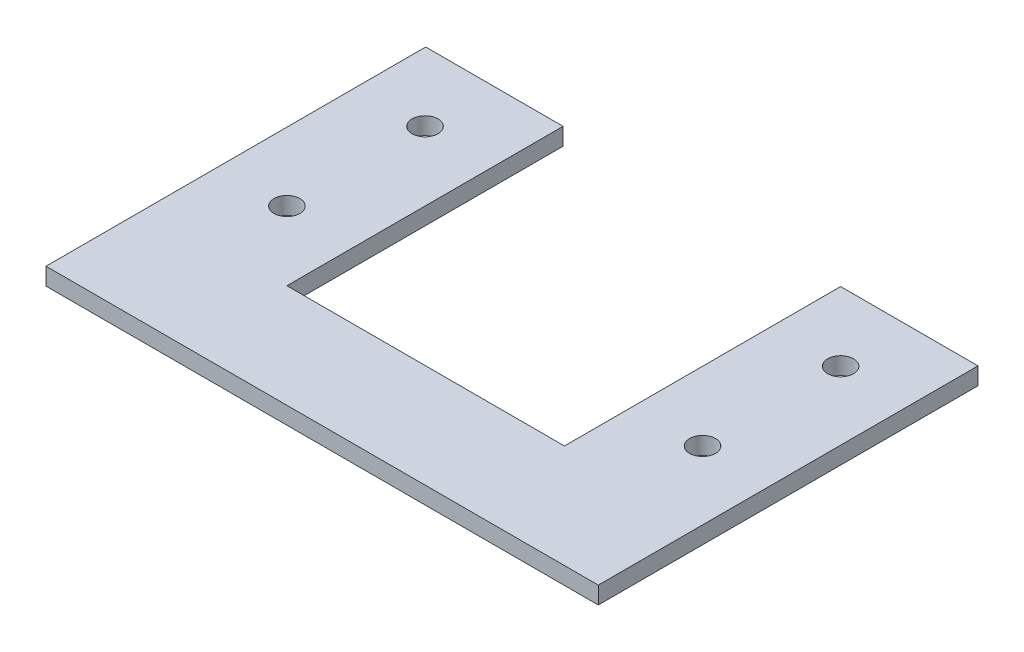
ISO-10303-21;
HEADER;
FILE_DESCRIPTION(('STEP AP214'),'2;1');
FILE_NAME('part.step','',(''),(''),'','','');
FILE_SCHEMA(('AUTOMOTIVE_DESIGN { 1 0 10303 214 1 1 1 1 }'));
ENDSEC;
DATA;
#1=APPLICATION_CONTEXT('core data for automotive mechanical design processes');
#2=APPLICATION_PROTOCOL_DEFINITION('international standard','automotive_design',2000,#1);
#3=PRODUCT_CONTEXT('',#1,'mechanical');
#4=PRODUCT('Part','Part','',(#3));
#5=PRODUCT_RELATED_PRODUCT_CATEGORY('part','',(#4));
#6=PRODUCT_DEFINITION_FORMATION('','',#4);
#7=PRODUCT_DEFINITION_CONTEXT('part definition',#1,'design');
#8=PRODUCT_DEFINITION('design','',#6,#7);
#9=PRODUCT_DEFINITION_SHAPE('','',#8);
#10=(LENGTH_UNIT() NAMED_UNIT(*) SI_UNIT(.MILLI.,.METRE.));
#11=(NAMED_UNIT(*) PLANE_ANGLE_UNIT() SI_UNIT($,.RADIAN.));
#12=(NAMED_UNIT(*) SI_UNIT($,.STERADIAN.) SOLID_ANGLE_UNIT());
#13=UNCERTAINTY_MEASURE_WITH_UNIT(LENGTH_MEASURE(1.E-05),#10,'distance_accuracy_value','');
#14=(GEOMETRIC_REPRESENTATION_CONTEXT(3) GLOBAL_UNCERTAINTY_ASSIGNED_CONTEXT((#13)) GLOBAL_UNIT_ASSIGNED_CONTEXT((#10,
#11,#12)) REPRESENTATION_CONTEXT('',''));
#15=CARTESIAN_POINT('',(0.,0.,0.));
#16=DIRECTION('',(0.,0.,1.));
#17=DIRECTION('',(1.,0.,0.));
#18=AXIS2_PLACEMENT_3D('',#15,#16,#17);
#19=CARTESIAN_POINT('',(0.,3.175,-34.925));
#20=DIRECTION('',(0.,0.,-1.));
#21=DIRECTION('',(-1.,0.,0.));
#22=AXIS2_PLACEMENT_3D('',#19,#20,#21);
#23=PLANE('',#22);
#24=DIRECTION('',(1.,0.,0.));
#25=VECTOR('',#24,1.);
#26=CARTESIAN_POINT('',(0.,0.,-34.925));
#27=LINE('',#26,#25);
#28=CARTESIAN_POINT('',(25.527,0.,-34.925));
#29=VERTEX_POINT('',#28);
#30=CARTESIAN_POINT('',(50.8,0.,-34.925));
#31=VERTEX_POINT('',#30);
#32=EDGE_CURVE('E155',#29,#31,#27,.T.);
#33=ORIENTED_EDGE('',*,*,#32,.F.);
#34=DIRECTION('',(0.,-1.,0.));
#35=VECTOR('',#34,1.);
#36=CARTESIAN_POINT('',(25.527,3.175,-34.925));
#37=LINE('',#36,#35);
#38=CARTESIAN_POINT('',(25.527,3.175,-34.925));
#39=VERTEX_POINT('',#38);
#40=EDGE_CURVE('E11',#39,#29,#37,.T.);
#41=ORIENTED_EDGE('',*,*,#40,.F.);
#42=DIRECTION('',(1.,0.,0.));
#43=VECTOR('',#42,1.);
#44=CARTESIAN_POINT('',(0.,3.175,-34.925));
#45=LINE('',#44,#43);
#46=CARTESIAN_POINT('',(50.8,3.175,-34.925));
#47=VERTEX_POINT('',#46);
#48=EDGE_CURVE('E200',#39,#47,#45,.T.);
#49=ORIENTED_EDGE('',*,*,#48,.T.);
#50=DIRECTION('',(0.,-1.,0.));
#51=VECTOR('',#50,1.);
#52=CARTESIAN_POINT('',(50.8,3.175,-34.925));
#53=LINE('',#52,#51);
#54=EDGE_CURVE('E56',#47,#31,#53,.T.);
#55=ORIENTED_EDGE('',*,*,#54,.T.);
#56=EDGE_LOOP('',(#33,#41,#49,#55));
#57=FACE_BOUND('',#56,.T.);
#58=ADVANCED_FACE('F39',(#57),#23,.T.);
#59=CARTESIAN_POINT('',(25.527,3.175,0.));
#60=DIRECTION('',(1.,0.,0.));
#61=DIRECTION('',(0.,0.,-1.));
#62=AXIS2_PLACEMENT_3D('',#59,#60,#61);
#63=PLANE('',#62);
#64=DIRECTION('',(0.,0.,1.));
#65=VECTOR('',#64,1.);
#66=CARTESIAN_POINT('',(25.527,0.,0.));
#67=LINE('',#66,#65);
#68=CARTESIAN_POINT('',(25.527,0.,15.875));
#69=VERTEX_POINT('',#68);
#70=EDGE_CURVE('E152',#29,#69,#67,.T.);
#71=ORIENTED_EDGE('',*,*,#70,.T.);
#72=DIRECTION('',(0.,-1.,0.));
#73=VECTOR('',#72,1.);
#74=CARTESIAN_POINT('',(25.527,3.175,15.875));
#75=LINE('',#74,#73);
#76=CARTESIAN_POINT('',(25.527,3.175,15.875));
#77=VERTEX_POINT('',#76);
#78=EDGE_CURVE('E48',#77,#69,#75,.T.);
#79=ORIENTED_EDGE('',*,*,#78,.F.);
#80=DIRECTION('',(0.,0.,1.));
#81=VECTOR('',#80,1.);
#82=CARTESIAN_POINT('',(25.527,3.175,0.));
#83=LINE('',#82,#81);
#84=EDGE_CURVE('E197',#39,#77,#83,.T.);
#85=ORIENTED_EDGE('',*,*,#84,.F.);
#86=ORIENTED_EDGE('',*,*,#40,.T.);
#87=EDGE_LOOP('',(#71,#79,#85,#86));
#88=FACE_BOUND('',#87,.T.);
#89=ADVANCED_FACE('F153',(#88),#63,.F.);
#90=CARTESIAN_POINT('',(0.,3.175,15.875));
#91=DIRECTION('',(0.,0.,-1.));
#92=DIRECTION('',(-1.,0.,0.));
#93=AXIS2_PLACEMENT_3D('',#90,#91,#92);
#94=PLANE('',#93);
#95=DIRECTION('',(1.,0.,0.));
#96=VECTOR('',#95,1.);
#97=CARTESIAN_POINT('',(0.,0.,15.875));
#98=LINE('',#97,#96);
#99=CARTESIAN_POINT('',(-25.527,0.,15.875));
#100=VERTEX_POINT('',#99);
#101=EDGE_CURVE('E146',#100,#69,#98,.T.);
#102=ORIENTED_EDGE('',*,*,#101,.F.);
#103=DIRECTION('',(0.,-1.,0.));
#104=VECTOR('',#103,1.);
#105=CARTESIAN_POINT('',(-25.527,3.175,15.875));
#106=LINE('',#105,#104);
#107=CARTESIAN_POINT('',(-25.527,3.175,15.875));
#108=VERTEX_POINT('',#107);
#109=EDGE_CURVE('E138',#108,#100,#106,.T.);
#110=ORIENTED_EDGE('',*,*,#109,.F.);
#111=DIRECTION('',(1.,0.,0.));
#112=VECTOR('',#111,1.);
#113=CARTESIAN_POINT('',(0.,3.175,15.875));
#114=LINE('',#113,#112);
#115=EDGE_CURVE('E149',#108,#77,#114,.T.);
#116=ORIENTED_EDGE('',*,*,#115,.T.);
#117=ORIENTED_EDGE('',*,*,#78,.T.);
#118=EDGE_LOOP('',(#102,#110,#116,#117));
#119=FACE_BOUND('',#118,.T.);
#120=ADVANCED_FACE('F144',(#119),#94,.T.);
#121=CARTESIAN_POINT('',(-25.527,3.175,0.));
#122=DIRECTION('',(1.,0.,0.));
#123=DIRECTION('',(0.,0.,-1.));
#124=AXIS2_PLACEMENT_3D('',#121,#122,#123);
#125=PLANE('',#124);
#126=DIRECTION('',(0.,0.,1.));
#127=VECTOR('',#126,1.);
#128=CARTESIAN_POINT('',(-25.527,0.,0.));
#129=LINE('',#128,#127);
#130=CARTESIAN_POINT('',(-25.527,0.,-34.925));
#131=VERTEX_POINT('',#130);
#132=EDGE_CURVE('E161',#131,#100,#129,.T.);
#133=ORIENTED_EDGE('',*,*,#132,.F.);
#134=DIRECTION('',(0.,-1.,0.));
#135=VECTOR('',#134,1.);
#136=CARTESIAN_POINT('',(-25.527,3.175,-34.925));
#137=LINE('',#136,#135);
#138=CARTESIAN_POINT('',(-25.527,3.175,-34.925));
#139=VERTEX_POINT('',#138);
#140=EDGE_CURVE('E132',#139,#131,#137,.T.);
#141=ORIENTED_EDGE('',*,*,#140,.F.);
#142=DIRECTION('',(0.,0.,1.));
#143=VECTOR('',#142,1.);
#144=CARTESIAN_POINT('',(-25.527,3.175,0.));
#145=LINE('',#144,#143);
#146=EDGE_CURVE('E196',#139,#108,#145,.T.);
#147=ORIENTED_EDGE('',*,*,#146,.T.);
#148=ORIENTED_EDGE('',*,*,#109,.T.);
#149=EDGE_LOOP('',(#133,#141,#147,#148));
#150=FACE_BOUND('',#149,.T.);
#151=ADVANCED_FACE('F195',(#150),#125,.T.);
#152=CARTESIAN_POINT('',(-50.8,0.,-34.925));
#153=VERTEX_POINT('',#152);
#154=EDGE_CURVE('E163',#153,#131,#27,.T.);
#155=ORIENTED_EDGE('',*,*,#154,.F.);
#156=DIRECTION('',(0.,-1.,0.));
#157=VECTOR('',#156,1.);
#158=CARTESIAN_POINT('',(-50.8,3.175,-34.925));
#159=LINE('',#158,#157);
#160=CARTESIAN_POINT('',(-50.8,3.175,-34.925));
#161=VERTEX_POINT('',#160);
#162=EDGE_CURVE('E130',#161,#153,#159,.T.);
#163=ORIENTED_EDGE('',*,*,#162,.F.);
#164=EDGE_CURVE('E124',#161,#139,#45,.T.);
#165=ORIENTED_EDGE('',*,*,#164,.T.);
#166=ORIENTED_EDGE('',*,*,#140,.T.);
#167=EDGE_LOOP('',(#155,#163,#165,#166));
#168=FACE_BOUND('',#167,.T.);
#169=ADVANCED_FACE('F192',(#168),#23,.T.);
#170=CARTESIAN_POINT('',(-50.8,3.175,0.));
#171=DIRECTION('',(1.,0.,0.));
#172=DIRECTION('',(0.,0.,-1.));
#173=AXIS2_PLACEMENT_3D('',#170,#171,#172);
#174=PLANE('',#173);
#175=DIRECTION('',(0.,0.,1.));
#176=VECTOR('',#175,1.);
#177=CARTESIAN_POINT('',(-50.8,0.,0.));
#178=LINE('',#177,#176);
#179=CARTESIAN_POINT('',(-50.8,0.,34.925));
#180=VERTEX_POINT('',#179);
#181=EDGE_CURVE('E129',#153,#180,#178,.T.);
#182=ORIENTED_EDGE('',*,*,#181,.T.);
#183=DIRECTION('',(0.,-1.,0.));
#184=VECTOR('',#183,1.);
#185=CARTESIAN_POINT('',(-50.8,3.175,34.925));
#186=LINE('',#185,#184);
#187=CARTESIAN_POINT('',(-50.8,3.175,34.925));
#188=VERTEX_POINT('',#187);
#189=EDGE_CURVE('E110',#188,#180,#186,.T.);
#190=ORIENTED_EDGE('',*,*,#189,.F.);
#191=DIRECTION('',(0.,0.,1.));
#192=VECTOR('',#191,1.);
#193=CARTESIAN_POINT('',(-50.8,3.175,0.));
#194=LINE('',#193,#192);
#195=EDGE_CURVE('E115',#161,#188,#194,.T.);
#196=ORIENTED_EDGE('',*,*,#195,.F.);
#197=ORIENTED_EDGE('',*,*,#162,.T.);
#198=EDGE_LOOP('',(#182,#190,#196,#197));
#199=FACE_BOUND('',#198,.T.);
#200=ADVANCED_FACE('F127',(#199),#174,.F.);
#201=CARTESIAN_POINT('',(0.,3.175,34.925));
#202=DIRECTION('',(0.,0.,-1.));
#203=DIRECTION('',(-1.,0.,0.));
#204=AXIS2_PLACEMENT_3D('',#201,#202,#203);
#205=PLANE('',#204);
#206=DIRECTION('',(1.,0.,0.));
#207=VECTOR('',#206,1.);
#208=CARTESIAN_POINT('',(0.,0.,34.925));
#209=LINE('',#208,#207);
#210=CARTESIAN_POINT('',(50.8,0.,34.925));
#211=VERTEX_POINT('',#210);
#212=EDGE_CURVE('E168',#180,#211,#209,.T.);
#213=ORIENTED_EDGE('',*,*,#212,.T.);
#214=DIRECTION('',(0.,-1.,0.));
#215=VECTOR('',#214,1.);
#216=CARTESIAN_POINT('',(50.8,3.175,34.925));
#217=LINE('',#216,#215);
#218=CARTESIAN_POINT('',(50.8,3.175,34.925));
#219=VERTEX_POINT('',#218);
#220=EDGE_CURVE('E82',#219,#211,#217,.T.);
#221=ORIENTED_EDGE('',*,*,#220,.F.);
#222=DIRECTION('',(1.,0.,0.));
#223=VECTOR('',#222,1.);
#224=CARTESIAN_POINT('',(0.,3.175,34.925));
#225=LINE('',#224,#223);
#226=EDGE_CURVE('E106',#188,#219,#225,.T.);
#227=ORIENTED_EDGE('',*,*,#226,.F.);
#228=ORIENTED_EDGE('',*,*,#189,.T.);
#229=EDGE_LOOP('',(#213,#221,#227,#228));
#230=FACE_BOUND('',#229,.T.);
#231=ADVANCED_FACE('F108',(#230),#205,.F.);
#232=CARTESIAN_POINT('',(50.8,3.175,0.));
#233=DIRECTION('',(1.,0.,0.));
#234=DIRECTION('',(0.,0.,-1.));
#235=AXIS2_PLACEMENT_3D('',#232,#233,#234);
#236=PLANE('',#235);
#237=DIRECTION('',(0.,0.,1.));
#238=VECTOR('',#237,1.);
#239=CARTESIAN_POINT('',(50.8,0.,0.));
#240=LINE('',#239,#238);
#241=EDGE_CURVE('E170',#31,#211,#240,.T.);
#242=ORIENTED_EDGE('',*,*,#241,.F.);
#243=ORIENTED_EDGE('',*,*,#54,.F.);
#244=DIRECTION('',(0.,0.,1.));
#245=VECTOR('',#244,1.);
#246=CARTESIAN_POINT('',(50.8,3.175,0.));
#247=LINE('',#246,#245);
#248=EDGE_CURVE('E114',#47,#219,#247,.T.);
#249=ORIENTED_EDGE('',*,*,#248,.T.);
#250=ORIENTED_EDGE('',*,*,#220,.T.);
#251=EDGE_LOOP('',(#242,#243,#249,#250));
#252=FACE_BOUND('',#251,.T.);
#253=ADVANCED_FACE('F230',(#252),#236,.T.);
#254=CARTESIAN_POINT('',(-38.227,3.175,-22.225));
#255=DIRECTION('',(0.,-1.,0.));
#256=DIRECTION('',(0.,0.,-1.));
#257=AXIS2_PLACEMENT_3D('',#254,#255,#256);
#258=CYLINDRICAL_SURFACE('',#257,2.38125);
#259=CARTESIAN_POINT('',(-38.227,3.175,-22.225));
#260=DIRECTION('',(0.,1.,0.));
#261=DIRECTION('',(0.,0.,1.));
#262=AXIS2_PLACEMENT_3D('',#259,#260,#261);
#263=CIRCLE('',#262,2.38125);
#264=CARTESIAN_POINT('',(-38.227,3.175,-19.84375));
#265=VERTEX_POINT('',#264);
#266=EDGE_CURVE('E204',#265,#265,#263,.T.);
#267=ORIENTED_EDGE('',*,*,#266,.T.);
#268=EDGE_LOOP('',(#267));
#269=FACE_BOUND('',#268,.T.);
#270=CARTESIAN_POINT('',(-38.227,0.,-22.225));
#271=DIRECTION('',(0.,1.,0.));
#272=DIRECTION('',(0.,0.,1.));
#273=AXIS2_PLACEMENT_3D('',#270,#271,#272);
#274=CIRCLE('',#273,2.38125);
#275=CARTESIAN_POINT('',(-38.227,0.,-19.84375));
#276=VERTEX_POINT('',#275);
#277=EDGE_CURVE('E188',#276,#276,#274,.T.);
#278=ORIENTED_EDGE('',*,*,#277,.F.);
#279=EDGE_LOOP('',(#278));
#280=FACE_BOUND('',#279,.T.);
#281=ADVANCED_FACE('F228',(#269,#280),#258,.F.);
#282=CARTESIAN_POINT('',(-38.227,3.175,3.175));
#283=DIRECTION('',(0.,-1.,0.));
#284=DIRECTION('',(0.,0.,-1.));
#285=AXIS2_PLACEMENT_3D('',#282,#283,#284);
#286=CYLINDRICAL_SURFACE('',#285,2.38125);
#287=CARTESIAN_POINT('',(-38.227,3.175,3.175));
#288=DIRECTION('',(0.,1.,0.));
#289=DIRECTION('',(0.,0.,1.));
#290=AXIS2_PLACEMENT_3D('',#287,#288,#289);
#291=CIRCLE('',#290,2.38125);
#292=CARTESIAN_POINT('',(-38.227,3.175,5.55625));
#293=VERTEX_POINT('',#292);
#294=EDGE_CURVE('E207',#293,#293,#291,.T.);
#295=ORIENTED_EDGE('',*,*,#294,.T.);
#296=EDGE_LOOP('',(#295));
#297=FACE_BOUND('',#296,.T.);
#298=CARTESIAN_POINT('',(-38.227,0.,3.175));
#299=DIRECTION('',(0.,1.,0.));
#300=DIRECTION('',(0.,0.,1.));
#301=AXIS2_PLACEMENT_3D('',#298,#299,#300);
#302=CIRCLE('',#301,2.38125);
#303=CARTESIAN_POINT('',(-38.227,0.,5.55625));
#304=VERTEX_POINT('',#303);
#305=EDGE_CURVE('E185',#304,#304,#302,.T.);
#306=ORIENTED_EDGE('',*,*,#305,.F.);
#307=EDGE_LOOP('',(#306));
#308=FACE_BOUND('',#307,.T.);
#309=ADVANCED_FACE('F218',(#297,#308),#286,.F.);
#310=CARTESIAN_POINT('',(38.227,3.175,3.17500000000003));
#311=DIRECTION('',(0.,-1.,0.));
#312=DIRECTION('',(0.,0.,-1.));
#313=AXIS2_PLACEMENT_3D('',#310,#311,#312);
#314=CYLINDRICAL_SURFACE('',#313,2.38125);
#315=CARTESIAN_POINT('',(38.227,3.175,3.17500000000003));
#316=DIRECTION('',(0.,1.,0.));
#317=DIRECTION('',(0.,0.,1.));
#318=AXIS2_PLACEMENT_3D('',#315,#316,#317);
#319=CIRCLE('',#318,2.38125);
#320=CARTESIAN_POINT('',(38.227,3.175,5.55625000000003));
#321=VERTEX_POINT('',#320);
#322=EDGE_CURVE('E175',#321,#321,#319,.F.);
#323=ORIENTED_EDGE('',*,*,#322,.F.);
#324=EDGE_LOOP('',(#323));
#325=FACE_BOUND('',#324,.T.);
#326=CARTESIAN_POINT('',(38.227,0.,3.17500000000003));
#327=DIRECTION('',(0.,1.,0.));
#328=DIRECTION('',(0.,0.,1.));
#329=AXIS2_PLACEMENT_3D('',#326,#327,#328);
#330=CIRCLE('',#329,2.38125);
#331=CARTESIAN_POINT('',(38.227,0.,5.55625000000003));
#332=VERTEX_POINT('',#331);
#333=EDGE_CURVE('E182',#332,#332,#330,.F.);
#334=ORIENTED_EDGE('',*,*,#333,.T.);
#335=EDGE_LOOP('',(#334));
#336=FACE_BOUND('',#335,.T.);
#337=ADVANCED_FACE('F41',(#325,#336),#314,.F.);
#338=CARTESIAN_POINT('',(38.227,3.175,-22.225));
#339=DIRECTION('',(0.,-1.,0.));
#340=DIRECTION('',(0.,0.,-1.));
#341=AXIS2_PLACEMENT_3D('',#338,#339,#340);
#342=CYLINDRICAL_SURFACE('',#341,2.38125);
#343=CARTESIAN_POINT('',(38.227,3.175,-22.225));
#344=DIRECTION('',(0.,1.,0.));
#345=DIRECTION('',(0.,0.,1.));
#346=AXIS2_PLACEMENT_3D('',#343,#344,#345);
#347=CIRCLE('',#346,2.38125);
#348=CARTESIAN_POINT('',(38.227,3.175,-19.84375));
#349=VERTEX_POINT('',#348);
#350=EDGE_CURVE('E176',#349,#349,#347,.F.);
#351=ORIENTED_EDGE('',*,*,#350,.F.);
#352=EDGE_LOOP('',(#351));
#353=FACE_BOUND('',#352,.T.);
#354=CARTESIAN_POINT('',(38.227,0.,-22.225));
#355=DIRECTION('',(0.,1.,0.));
#356=DIRECTION('',(0.,0.,1.));
#357=AXIS2_PLACEMENT_3D('',#354,#355,#356);
#358=CIRCLE('',#357,2.38125);
#359=CARTESIAN_POINT('',(38.227,0.,-19.84375));
#360=VERTEX_POINT('',#359);
#361=EDGE_CURVE('E173',#360,#360,#358,.F.);
#362=ORIENTED_EDGE('',*,*,#361,.T.);
#363=EDGE_LOOP('',(#362));
#364=FACE_BOUND('',#363,.T.);
#365=ADVANCED_FACE('F217',(#353,#364),#342,.F.);
#366=CARTESIAN_POINT('',(0.,3.175,0.));
#367=DIRECTION('',(0.,1.,0.));
#368=DIRECTION('',(0.,0.,1.));
#369=AXIS2_PLACEMENT_3D('',#366,#367,#368);
#370=PLANE('',#369);
#371=ORIENTED_EDGE('',*,*,#322,.T.);
#372=EDGE_LOOP('',(#371));
#373=FACE_BOUND('',#372,.T.);
#374=ORIENTED_EDGE('',*,*,#294,.F.);
#375=EDGE_LOOP('',(#374));
#376=FACE_BOUND('',#375,.T.);
#377=ORIENTED_EDGE('',*,*,#266,.F.);
#378=EDGE_LOOP('',(#377));
#379=FACE_BOUND('',#378,.T.);
#380=ORIENTED_EDGE('',*,*,#48,.F.);
#381=ORIENTED_EDGE('',*,*,#84,.T.);
#382=ORIENTED_EDGE('',*,*,#115,.F.);
#383=ORIENTED_EDGE('',*,*,#146,.F.);
#384=ORIENTED_EDGE('',*,*,#164,.F.);
#385=ORIENTED_EDGE('',*,*,#195,.T.);
#386=ORIENTED_EDGE('',*,*,#226,.T.);
#387=ORIENTED_EDGE('',*,*,#248,.F.);
#388=EDGE_LOOP('',(#380,#381,#382,#383,#384,#385,#386,#387));
#389=FACE_BOUND('',#388,.T.);
#390=ORIENTED_EDGE('',*,*,#350,.T.);
#391=EDGE_LOOP('',(#390));
#392=FACE_BOUND('',#391,.T.);
#393=ADVANCED_FACE('F120',(#373,#376,#379,#389,#392),#370,.T.);
#394=CARTESIAN_POINT('',(0.,0.,0.));
#395=DIRECTION('',(0.,1.,0.));
#396=DIRECTION('',(0.,0.,1.));
#397=AXIS2_PLACEMENT_3D('',#394,#395,#396);
#398=PLANE('',#397);
#399=ORIENTED_EDGE('',*,*,#333,.F.);
#400=EDGE_LOOP('',(#399));
#401=FACE_BOUND('',#400,.T.);
#402=ORIENTED_EDGE('',*,*,#305,.T.);
#403=EDGE_LOOP('',(#402));
#404=FACE_BOUND('',#403,.T.);
#405=ORIENTED_EDGE('',*,*,#277,.T.);
#406=EDGE_LOOP('',(#405));
#407=FACE_BOUND('',#406,.T.);
#408=ORIENTED_EDGE('',*,*,#32,.T.);
#409=ORIENTED_EDGE('',*,*,#241,.T.);
#410=ORIENTED_EDGE('',*,*,#212,.F.);
#411=ORIENTED_EDGE('',*,*,#181,.F.);
#412=ORIENTED_EDGE('',*,*,#154,.T.);
#413=ORIENTED_EDGE('',*,*,#132,.T.);
#414=ORIENTED_EDGE('',*,*,#101,.T.);
#415=ORIENTED_EDGE('',*,*,#70,.F.);
#416=EDGE_LOOP('',(#408,#409,#410,#411,#412,#413,#414,#415));
#417=FACE_BOUND('',#416,.T.);
#418=ORIENTED_EDGE('',*,*,#361,.F.);
#419=EDGE_LOOP('',(#418));
#420=FACE_BOUND('',#419,.T.);
#421=ADVANCED_FACE('F157',(#401,#404,#407,#417,#420),#398,.F.);
#422=CLOSED_SHELL('',(#58,#89,#120,#151,#169,#200,#231,#253,#281,#309,#337,#365,#393,#421));
#423=MANIFOLD_SOLID_BREP('B2',#422);
#424=ADVANCED_BREP_SHAPE_REPRESENTATION('',(#18,#423),#14);
#425=SHAPE_DEFINITION_REPRESENTATION(#9,#424);
ENDSEC;
END-ISO-10303-21;
